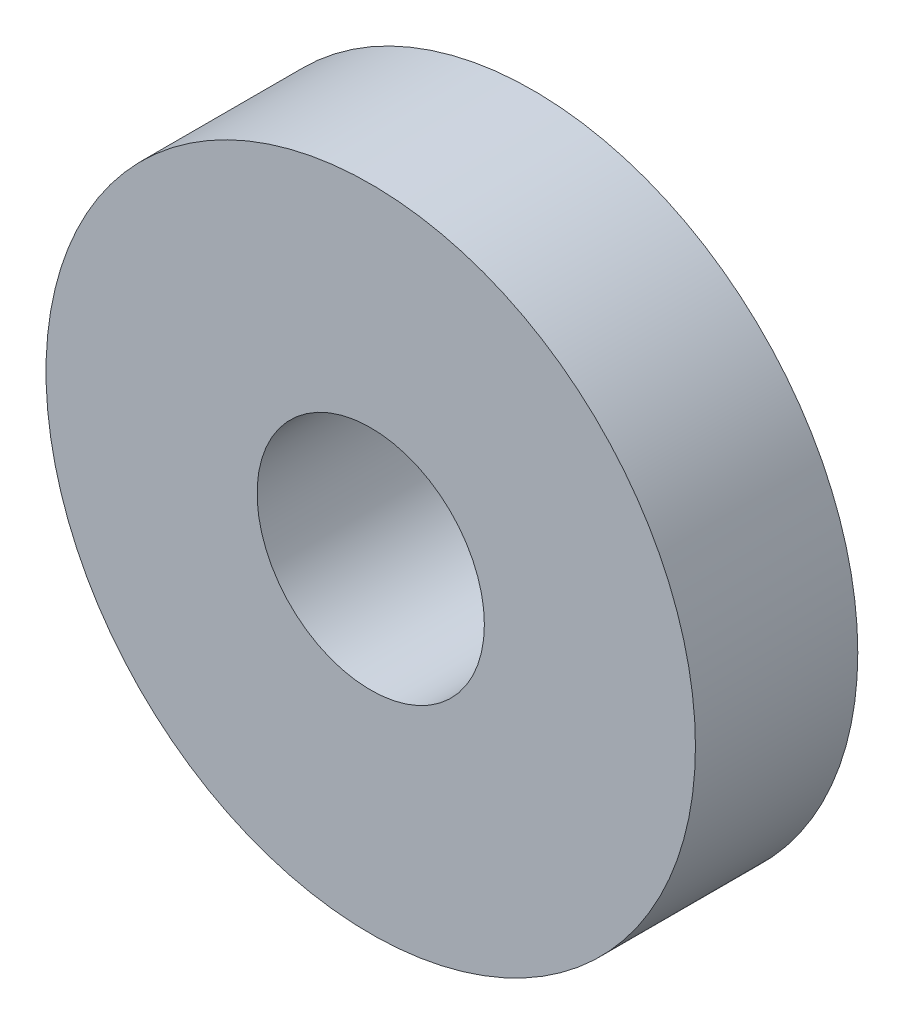
ISO-10303-21;
HEADER;
FILE_DESCRIPTION(('STEP AP214'),'2;1');
FILE_NAME('part.step','',(''),(''),'','','');
FILE_SCHEMA(('AUTOMOTIVE_DESIGN { 1 0 10303 214 1 1 1 1 }'));
ENDSEC;
DATA;
#1=APPLICATION_CONTEXT('core data for automotive mechanical design processes');
#2=APPLICATION_PROTOCOL_DEFINITION('international standard','automotive_design',2000,#1);
#3=PRODUCT_CONTEXT('',#1,'mechanical');
#4=PRODUCT('Part','Part','',(#3));
#5=PRODUCT_RELATED_PRODUCT_CATEGORY('part','',(#4));
#6=PRODUCT_DEFINITION_FORMATION('','',#4);
#7=PRODUCT_DEFINITION_CONTEXT('part definition',#1,'design');
#8=PRODUCT_DEFINITION('design','',#6,#7);
#9=PRODUCT_DEFINITION_SHAPE('','',#8);
#10=(LENGTH_UNIT() NAMED_UNIT(*) SI_UNIT(.MILLI.,.METRE.));
#11=(NAMED_UNIT(*) PLANE_ANGLE_UNIT() SI_UNIT($,.RADIAN.));
#12=(NAMED_UNIT(*) SI_UNIT($,.STERADIAN.) SOLID_ANGLE_UNIT());
#13=UNCERTAINTY_MEASURE_WITH_UNIT(LENGTH_MEASURE(1.E-05),#10,'distance_accuracy_value','');
#14=(GEOMETRIC_REPRESENTATION_CONTEXT(3) GLOBAL_UNCERTAINTY_ASSIGNED_CONTEXT((#13)) GLOBAL_UNIT_ASSIGNED_CONTEXT((#10,
#11,#12)) REPRESENTATION_CONTEXT('',''));
#15=CARTESIAN_POINT('',(0.,0.,0.));
#16=DIRECTION('',(0.,0.,1.));
#17=DIRECTION('',(1.,0.,0.));
#18=AXIS2_PLACEMENT_3D('',#15,#16,#17);
#19=CARTESIAN_POINT('',(0.,0.,10.));
#20=DIRECTION('',(0.,0.,1.));
#21=DIRECTION('',(1.,0.,0.));
#22=AXIS2_PLACEMENT_3D('',#19,#20,#21);
#23=PLANE('',#22);
#24=CARTESIAN_POINT('',(0.,0.,10.));
#25=DIRECTION('',(0.,0.,1.));
#26=DIRECTION('',(1.,0.,0.));
#27=AXIS2_PLACEMENT_3D('',#24,#25,#26);
#28=CIRCLE('',#27,20.);
#29=CARTESIAN_POINT('',(20.,0.,10.));
#30=VERTEX_POINT('',#29);
#31=EDGE_CURVE('E8',#30,#30,#28,.T.);
#32=ORIENTED_EDGE('',*,*,#31,.T.);
#33=EDGE_LOOP('',(#32));
#34=FACE_BOUND('',#33,.T.);
#35=CARTESIAN_POINT('',(0.,0.,10.));
#36=DIRECTION('',(0.,0.,1.));
#37=DIRECTION('',(1.,0.,0.));
#38=AXIS2_PLACEMENT_3D('',#35,#36,#37);
#39=CIRCLE('',#38,7.);
#40=CARTESIAN_POINT('',(7.,0.,10.));
#41=VERTEX_POINT('',#40);
#42=EDGE_CURVE('E27',#41,#41,#39,.T.);
#43=ORIENTED_EDGE('',*,*,#42,.F.);
#44=EDGE_LOOP('',(#43));
#45=FACE_BOUND('',#44,.T.);
#46=ADVANCED_FACE('F13',(#34,#45),#23,.T.);
#47=CARTESIAN_POINT('',(0.,0.,0.));
#48=DIRECTION('',(0.,0.,1.));
#49=DIRECTION('',(1.,0.,0.));
#50=AXIS2_PLACEMENT_3D('',#47,#48,#49);
#51=PLANE('',#50);
#52=CARTESIAN_POINT('',(0.,0.,0.));
#53=DIRECTION('',(0.,0.,1.));
#54=DIRECTION('',(1.,0.,0.));
#55=AXIS2_PLACEMENT_3D('',#52,#53,#54);
#56=CIRCLE('',#55,20.);
#57=CARTESIAN_POINT('',(20.,0.,0.));
#58=VERTEX_POINT('',#57);
#59=EDGE_CURVE('E17',#58,#58,#56,.T.);
#60=ORIENTED_EDGE('',*,*,#59,.F.);
#61=EDGE_LOOP('',(#60));
#62=FACE_BOUND('',#61,.T.);
#63=CARTESIAN_POINT('',(0.,0.,0.));
#64=DIRECTION('',(0.,0.,1.));
#65=DIRECTION('',(1.,0.,0.));
#66=AXIS2_PLACEMENT_3D('',#63,#64,#65);
#67=CIRCLE('',#66,7.);
#68=CARTESIAN_POINT('',(7.,0.,0.));
#69=VERTEX_POINT('',#68);
#70=EDGE_CURVE('E29',#69,#69,#67,.T.);
#71=ORIENTED_EDGE('',*,*,#70,.T.);
#72=EDGE_LOOP('',(#71));
#73=FACE_BOUND('',#72,.T.);
#74=ADVANCED_FACE('F41',(#62,#73),#51,.F.);
#75=CARTESIAN_POINT('',(0.,0.,10.));
#76=DIRECTION('',(0.,0.,-1.));
#77=DIRECTION('',(-1.,0.,0.));
#78=AXIS2_PLACEMENT_3D('',#75,#76,#77);
#79=CYLINDRICAL_SURFACE('',#78,20.);
#80=ORIENTED_EDGE('',*,*,#31,.F.);
#81=EDGE_LOOP('',(#80));
#82=FACE_BOUND('',#81,.T.);
#83=ORIENTED_EDGE('',*,*,#59,.T.);
#84=EDGE_LOOP('',(#83));
#85=FACE_BOUND('',#84,.T.);
#86=ADVANCED_FACE('F15',(#82,#85),#79,.T.);
#87=CARTESIAN_POINT('',(0.,0.,10.));
#88=DIRECTION('',(0.,0.,-1.));
#89=DIRECTION('',(-1.,0.,0.));
#90=AXIS2_PLACEMENT_3D('',#87,#88,#89);
#91=CYLINDRICAL_SURFACE('',#90,7.);
#92=ORIENTED_EDGE('',*,*,#42,.T.);
#93=EDGE_LOOP('',(#92));
#94=FACE_BOUND('',#93,.T.);
#95=ORIENTED_EDGE('',*,*,#70,.F.);
#96=EDGE_LOOP('',(#95));
#97=FACE_BOUND('',#96,.T.);
#98=ADVANCED_FACE('F37',(#94,#97),#91,.F.);
#99=CLOSED_SHELL('',(#46,#74,#86,#98));
#100=MANIFOLD_SOLID_BREP('B1',#99);
#101=ADVANCED_BREP_SHAPE_REPRESENTATION('',(#18,#100),#14);
#102=SHAPE_DEFINITION_REPRESENTATION(#9,#101);
ENDSEC;
END-ISO-10303-21;
